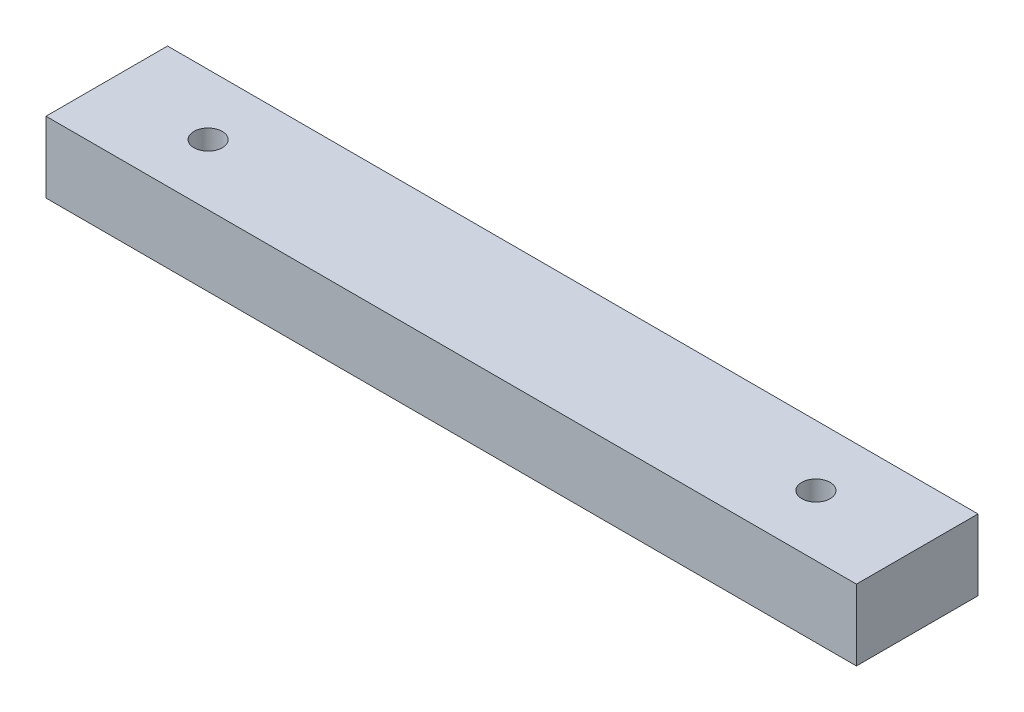
ISO-10303-21;
HEADER;
FILE_DESCRIPTION(('STEP AP214'),'2;1');
FILE_NAME('part.step','',(''),(''),'','','');
FILE_SCHEMA(('AUTOMOTIVE_DESIGN { 1 0 10303 214 1 1 1 1 }'));
ENDSEC;
DATA;
#1=APPLICATION_CONTEXT('core data for automotive mechanical design processes');
#2=APPLICATION_PROTOCOL_DEFINITION('international standard','automotive_design',2000,#1);
#3=PRODUCT_CONTEXT('',#1,'mechanical');
#4=PRODUCT('Part','Part','',(#3));
#5=PRODUCT_RELATED_PRODUCT_CATEGORY('part','',(#4));
#6=PRODUCT_DEFINITION_FORMATION('','',#4);
#7=PRODUCT_DEFINITION_CONTEXT('part definition',#1,'design');
#8=PRODUCT_DEFINITION('design','',#6,#7);
#9=PRODUCT_DEFINITION_SHAPE('','',#8);
#10=(LENGTH_UNIT() NAMED_UNIT(*) SI_UNIT(.MILLI.,.METRE.));
#11=(NAMED_UNIT(*) PLANE_ANGLE_UNIT() SI_UNIT($,.RADIAN.));
#12=(NAMED_UNIT(*) SI_UNIT($,.STERADIAN.) SOLID_ANGLE_UNIT());
#13=UNCERTAINTY_MEASURE_WITH_UNIT(LENGTH_MEASURE(1.E-05),#10,'distance_accuracy_value','');
#14=(GEOMETRIC_REPRESENTATION_CONTEXT(3) GLOBAL_UNCERTAINTY_ASSIGNED_CONTEXT((#13)) GLOBAL_UNIT_ASSIGNED_CONTEXT((#10,
#11,#12)) REPRESENTATION_CONTEXT('',''));
#15=CARTESIAN_POINT('',(0.,0.,0.));
#16=DIRECTION('',(0.,0.,1.));
#17=DIRECTION('',(1.,0.,0.));
#18=AXIS2_PLACEMENT_3D('',#15,#16,#17);
#19=CARTESIAN_POINT('',(200.,35.,30.));
#20=DIRECTION('',(-1.,0.,0.));
#21=DIRECTION('',(0.,0.,1.));
#22=AXIS2_PLACEMENT_3D('',#19,#20,#21);
#23=PLANE('',#22);
#24=DIRECTION('',(0.,0.,-1.));
#25=VECTOR('',#24,1.);
#26=CARTESIAN_POINT('',(200.,0.,30.));
#27=LINE('',#26,#25);
#28=CARTESIAN_POINT('',(200.,0.,30.));
#29=VERTEX_POINT('',#28);
#30=CARTESIAN_POINT('',(200.,0.,-30.));
#31=VERTEX_POINT('',#30);
#32=EDGE_CURVE('E201',#29,#31,#27,.T.);
#33=ORIENTED_EDGE('',*,*,#32,.T.);
#34=DIRECTION('',(0.,-1.,0.));
#35=VECTOR('',#34,1.);
#36=CARTESIAN_POINT('',(200.,35.,-30.));
#37=LINE('',#36,#35);
#38=CARTESIAN_POINT('',(200.,35.,-30.));
#39=VERTEX_POINT('',#38);
#40=EDGE_CURVE('E11',#39,#31,#37,.T.);
#41=ORIENTED_EDGE('',*,*,#40,.F.);
#42=DIRECTION('',(0.,0.,-1.));
#43=VECTOR('',#42,1.);
#44=CARTESIAN_POINT('',(200.,35.,30.));
#45=LINE('',#44,#43);
#46=CARTESIAN_POINT('',(200.,35.,30.));
#47=VERTEX_POINT('',#46);
#48=EDGE_CURVE('E215',#47,#39,#45,.T.);
#49=ORIENTED_EDGE('',*,*,#48,.F.);
#50=DIRECTION('',(0.,-1.,0.));
#51=VECTOR('',#50,1.);
#52=CARTESIAN_POINT('',(200.,35.,30.));
#53=LINE('',#52,#51);
#54=EDGE_CURVE('E217',#47,#29,#53,.T.);
#55=ORIENTED_EDGE('',*,*,#54,.T.);
#56=EDGE_LOOP('',(#33,#41,#49,#55));
#57=FACE_BOUND('',#56,.T.);
#58=ADVANCED_FACE('F50',(#57),#23,.F.);
#59=CARTESIAN_POINT('',(-200.,35.,-30.));
#60=DIRECTION('',(0.,0.,1.));
#61=DIRECTION('',(1.,0.,0.));
#62=AXIS2_PLACEMENT_3D('',#59,#60,#61);
#63=PLANE('',#62);
#64=DIRECTION('',(-1.,0.,0.));
#65=VECTOR('',#64,1.);
#66=CARTESIAN_POINT('',(-200.,0.,-30.));
#67=LINE('',#66,#65);
#68=CARTESIAN_POINT('',(-200.,0.,-30.));
#69=VERTEX_POINT('',#68);
#70=EDGE_CURVE('E222',#31,#69,#67,.T.);
#71=ORIENTED_EDGE('',*,*,#70,.T.);
#72=DIRECTION('',(0.,-1.,0.));
#73=VECTOR('',#72,1.);
#74=CARTESIAN_POINT('',(-200.,35.,-30.));
#75=LINE('',#74,#73);
#76=CARTESIAN_POINT('',(-200.,35.,-30.));
#77=VERTEX_POINT('',#76);
#78=EDGE_CURVE('E54',#77,#69,#75,.T.);
#79=ORIENTED_EDGE('',*,*,#78,.F.);
#80=DIRECTION('',(-1.,0.,0.));
#81=VECTOR('',#80,1.);
#82=CARTESIAN_POINT('',(-200.,35.,-30.));
#83=LINE('',#82,#81);
#84=EDGE_CURVE('E94',#39,#77,#83,.T.);
#85=ORIENTED_EDGE('',*,*,#84,.F.);
#86=ORIENTED_EDGE('',*,*,#40,.T.);
#87=EDGE_LOOP('',(#71,#79,#85,#86));
#88=FACE_BOUND('',#87,.T.);
#89=ADVANCED_FACE('F245',(#88),#63,.F.);
#90=CARTESIAN_POINT('',(-200.,35.,30.));
#91=DIRECTION('',(1.,0.,0.));
#92=DIRECTION('',(0.,0.,-1.));
#93=AXIS2_PLACEMENT_3D('',#90,#91,#92);
#94=PLANE('',#93);
#95=DIRECTION('',(0.,0.,1.));
#96=VECTOR('',#95,1.);
#97=CARTESIAN_POINT('',(-200.,0.,30.));
#98=LINE('',#97,#96);
#99=CARTESIAN_POINT('',(-200.,0.,30.));
#100=VERTEX_POINT('',#99);
#101=EDGE_CURVE('E81',#69,#100,#98,.T.);
#102=ORIENTED_EDGE('',*,*,#101,.T.);
#103=DIRECTION('',(0.,-1.,0.));
#104=VECTOR('',#103,1.);
#105=CARTESIAN_POINT('',(-200.,35.,30.));
#106=LINE('',#105,#104);
#107=CARTESIAN_POINT('',(-200.,35.,30.));
#108=VERTEX_POINT('',#107);
#109=EDGE_CURVE('E226',#108,#100,#106,.T.);
#110=ORIENTED_EDGE('',*,*,#109,.F.);
#111=DIRECTION('',(0.,0.,1.));
#112=VECTOR('',#111,1.);
#113=CARTESIAN_POINT('',(-200.,35.,30.));
#114=LINE('',#113,#112);
#115=EDGE_CURVE('E214',#77,#108,#114,.T.);
#116=ORIENTED_EDGE('',*,*,#115,.F.);
#117=ORIENTED_EDGE('',*,*,#78,.T.);
#118=EDGE_LOOP('',(#102,#110,#116,#117));
#119=FACE_BOUND('',#118,.T.);
#120=ADVANCED_FACE('F229',(#119),#94,.F.);
#121=CARTESIAN_POINT('',(-200.,35.,30.));
#122=DIRECTION('',(0.,0.,-1.));
#123=DIRECTION('',(-1.,0.,0.));
#124=AXIS2_PLACEMENT_3D('',#121,#122,#123);
#125=PLANE('',#124);
#126=DIRECTION('',(1.,0.,0.));
#127=VECTOR('',#126,1.);
#128=CARTESIAN_POINT('',(-200.,0.,30.));
#129=LINE('',#128,#127);
#130=EDGE_CURVE('E87',#100,#29,#129,.T.);
#131=ORIENTED_EDGE('',*,*,#130,.T.);
#132=ORIENTED_EDGE('',*,*,#54,.F.);
#133=DIRECTION('',(1.,0.,0.));
#134=VECTOR('',#133,1.);
#135=CARTESIAN_POINT('',(-200.,35.,30.));
#136=LINE('',#135,#134);
#137=EDGE_CURVE('E64',#108,#47,#136,.T.);
#138=ORIENTED_EDGE('',*,*,#137,.F.);
#139=ORIENTED_EDGE('',*,*,#109,.T.);
#140=EDGE_LOOP('',(#131,#132,#138,#139));
#141=FACE_BOUND('',#140,.T.);
#142=ADVANCED_FACE('F235',(#141),#125,.F.);
#143=CARTESIAN_POINT('',(0.,35.,0.));
#144=DIRECTION('',(0.,-1.,0.));
#145=DIRECTION('',(0.,0.,-1.));
#146=AXIS2_PLACEMENT_3D('',#143,#144,#145);
#147=PLANE('',#146);
#148=CARTESIAN_POINT('',(-150.,35.,0.));
#149=DIRECTION('',(0.,1.,0.));
#150=DIRECTION('',(0.,0.,1.));
#151=AXIS2_PLACEMENT_3D('',#148,#149,#150);
#152=CIRCLE('',#151,7.00000000000001);
#153=CARTESIAN_POINT('',(-150.,35.,7.00000000000001));
#154=VERTEX_POINT('',#153);
#155=EDGE_CURVE('E204',#154,#154,#152,.T.);
#156=ORIENTED_EDGE('',*,*,#155,.F.);
#157=EDGE_LOOP('',(#156));
#158=FACE_BOUND('',#157,.T.);
#159=CARTESIAN_POINT('',(150.,35.,0.));
#160=DIRECTION('',(0.,1.,0.));
#161=DIRECTION('',(0.,0.,1.));
#162=AXIS2_PLACEMENT_3D('',#159,#160,#161);
#163=CIRCLE('',#162,7.00000000000001);
#164=CARTESIAN_POINT('',(150.,35.,7.00000000000001));
#165=VERTEX_POINT('',#164);
#166=EDGE_CURVE('E210',#165,#165,#163,.T.);
#167=ORIENTED_EDGE('',*,*,#166,.F.);
#168=EDGE_LOOP('',(#167));
#169=FACE_BOUND('',#168,.T.);
#170=ORIENTED_EDGE('',*,*,#48,.T.);
#171=ORIENTED_EDGE('',*,*,#84,.T.);
#172=ORIENTED_EDGE('',*,*,#115,.T.);
#173=ORIENTED_EDGE('',*,*,#137,.T.);
#174=EDGE_LOOP('',(#170,#171,#172,#173));
#175=FACE_BOUND('',#174,.T.);
#176=ADVANCED_FACE('F240',(#158,#169,#175),#147,.F.);
#177=CARTESIAN_POINT('',(0.,0.,0.));
#178=DIRECTION('',(0.,-1.,0.));
#179=DIRECTION('',(0.,0.,-1.));
#180=AXIS2_PLACEMENT_3D('',#177,#178,#179);
#181=PLANE('',#180);
#182=CARTESIAN_POINT('',(-168.77,0.,18.77));
#183=DIRECTION('',(0.,-1.,0.));
#184=DIRECTION('',(0.,0.,-1.));
#185=AXIS2_PLACEMENT_3D('',#182,#183,#184);
#186=CIRCLE('',#185,3.81000000000001);
#187=CARTESIAN_POINT('',(-168.77,0.,14.96));
#188=VERTEX_POINT('',#187);
#189=EDGE_CURVE('E136',#188,#188,#186,.T.);
#190=ORIENTED_EDGE('',*,*,#189,.F.);
#191=EDGE_LOOP('',(#190));
#192=FACE_BOUND('',#191,.T.);
#193=CARTESIAN_POINT('',(-131.23,0.,18.77));
#194=DIRECTION('',(0.,-1.,0.));
#195=DIRECTION('',(0.,0.,-1.));
#196=AXIS2_PLACEMENT_3D('',#193,#194,#195);
#197=CIRCLE('',#196,3.81000000000001);
#198=CARTESIAN_POINT('',(-131.23,0.,14.96));
#199=VERTEX_POINT('',#198);
#200=EDGE_CURVE('E129',#199,#199,#197,.T.);
#201=ORIENTED_EDGE('',*,*,#200,.F.);
#202=EDGE_LOOP('',(#201));
#203=FACE_BOUND('',#202,.T.);
#204=CARTESIAN_POINT('',(-131.23,0.,-18.77));
#205=DIRECTION('',(0.,-1.,0.));
#206=DIRECTION('',(0.,0.,-1.));
#207=AXIS2_PLACEMENT_3D('',#204,#205,#206);
#208=CIRCLE('',#207,3.81000000000001);
#209=CARTESIAN_POINT('',(-131.23,0.,-22.58));
#210=VERTEX_POINT('',#209);
#211=EDGE_CURVE('E144',#210,#210,#208,.T.);
#212=ORIENTED_EDGE('',*,*,#211,.F.);
#213=EDGE_LOOP('',(#212));
#214=FACE_BOUND('',#213,.T.);
#215=CARTESIAN_POINT('',(-168.77,0.,-18.77));
#216=DIRECTION('',(0.,-1.,0.));
#217=DIRECTION('',(0.,0.,-1.));
#218=AXIS2_PLACEMENT_3D('',#215,#216,#217);
#219=CIRCLE('',#218,3.81000000000001);
#220=CARTESIAN_POINT('',(-168.77,0.,-22.58));
#221=VERTEX_POINT('',#220);
#222=EDGE_CURVE('E152',#221,#221,#219,.T.);
#223=ORIENTED_EDGE('',*,*,#222,.F.);
#224=EDGE_LOOP('',(#223));
#225=FACE_BOUND('',#224,.T.);
#226=CARTESIAN_POINT('',(131.23,0.,18.77));
#227=DIRECTION('',(0.,-1.,0.));
#228=DIRECTION('',(0.,0.,-1.));
#229=AXIS2_PLACEMENT_3D('',#226,#227,#228);
#230=CIRCLE('',#229,3.81000000000001);
#231=CARTESIAN_POINT('',(131.23,0.,14.96));
#232=VERTEX_POINT('',#231);
#233=EDGE_CURVE('E162',#232,#232,#230,.T.);
#234=ORIENTED_EDGE('',*,*,#233,.F.);
#235=EDGE_LOOP('',(#234));
#236=FACE_BOUND('',#235,.T.);
#237=CARTESIAN_POINT('',(168.77,0.,18.77));
#238=DIRECTION('',(0.,-1.,0.));
#239=DIRECTION('',(0.,0.,-1.));
#240=AXIS2_PLACEMENT_3D('',#237,#238,#239);
#241=CIRCLE('',#240,3.81000000000001);
#242=CARTESIAN_POINT('',(168.77,0.,14.96));
#243=VERTEX_POINT('',#242);
#244=EDGE_CURVE('E172',#243,#243,#241,.T.);
#245=ORIENTED_EDGE('',*,*,#244,.F.);
#246=EDGE_LOOP('',(#245));
#247=FACE_BOUND('',#246,.T.);
#248=CARTESIAN_POINT('',(168.77,0.,-18.77));
#249=DIRECTION('',(0.,-1.,0.));
#250=DIRECTION('',(0.,0.,-1.));
#251=AXIS2_PLACEMENT_3D('',#248,#249,#250);
#252=CIRCLE('',#251,3.81000000000001);
#253=CARTESIAN_POINT('',(168.77,0.,-22.58));
#254=VERTEX_POINT('',#253);
#255=EDGE_CURVE('E182',#254,#254,#252,.T.);
#256=ORIENTED_EDGE('',*,*,#255,.F.);
#257=EDGE_LOOP('',(#256));
#258=FACE_BOUND('',#257,.T.);
#259=CARTESIAN_POINT('',(131.23,0.,-18.77));
#260=DIRECTION('',(0.,-1.,0.));
#261=DIRECTION('',(0.,0.,-1.));
#262=AXIS2_PLACEMENT_3D('',#259,#260,#261);
#263=CIRCLE('',#262,3.81000000000001);
#264=CARTESIAN_POINT('',(131.23,0.,-22.58));
#265=VERTEX_POINT('',#264);
#266=EDGE_CURVE('E190',#265,#265,#263,.T.);
#267=ORIENTED_EDGE('',*,*,#266,.F.);
#268=EDGE_LOOP('',(#267));
#269=FACE_BOUND('',#268,.T.);
#270=CARTESIAN_POINT('',(-150.,0.,0.));
#271=DIRECTION('',(0.,1.,0.));
#272=DIRECTION('',(0.,0.,1.));
#273=AXIS2_PLACEMENT_3D('',#270,#271,#272);
#274=CIRCLE('',#273,7.00000000000001);
#275=CARTESIAN_POINT('',(-150.,0.,7.00000000000001));
#276=VERTEX_POINT('',#275);
#277=EDGE_CURVE('E199',#276,#276,#274,.T.);
#278=ORIENTED_EDGE('',*,*,#277,.T.);
#279=EDGE_LOOP('',(#278));
#280=FACE_BOUND('',#279,.T.);
#281=CARTESIAN_POINT('',(150.,0.,0.));
#282=DIRECTION('',(0.,1.,0.));
#283=DIRECTION('',(0.,0.,1.));
#284=AXIS2_PLACEMENT_3D('',#281,#282,#283);
#285=CIRCLE('',#284,7.00000000000001);
#286=CARTESIAN_POINT('',(150.,0.,7.00000000000001));
#287=VERTEX_POINT('',#286);
#288=EDGE_CURVE('E200',#287,#287,#285,.T.);
#289=ORIENTED_EDGE('',*,*,#288,.T.);
#290=EDGE_LOOP('',(#289));
#291=FACE_BOUND('',#290,.T.);
#292=ORIENTED_EDGE('',*,*,#32,.F.);
#293=ORIENTED_EDGE('',*,*,#130,.F.);
#294=ORIENTED_EDGE('',*,*,#101,.F.);
#295=ORIENTED_EDGE('',*,*,#70,.F.);
#296=EDGE_LOOP('',(#292,#293,#294,#295));
#297=FACE_BOUND('',#296,.T.);
#298=ADVANCED_FACE('F231',(#192,#203,#214,#225,#236,#247,#258,#269,#280,#291,#297),#181,.T.);
#299=CARTESIAN_POINT('',(150.,0.,0.));
#300=DIRECTION('',(0.,1.,0.));
#301=DIRECTION('',(0.,0.,1.));
#302=AXIS2_PLACEMENT_3D('',#299,#300,#301);
#303=CYLINDRICAL_SURFACE('',#302,7.00000000000001);
#304=ORIENTED_EDGE('',*,*,#288,.F.);
#305=EDGE_LOOP('',(#304));
#306=FACE_BOUND('',#305,.T.);
#307=ORIENTED_EDGE('',*,*,#166,.T.);
#308=EDGE_LOOP('',(#307));
#309=FACE_BOUND('',#308,.T.);
#310=ADVANCED_FACE('F281',(#306,#309),#303,.F.);
#311=CARTESIAN_POINT('',(-150.,0.,0.));
#312=DIRECTION('',(0.,1.,0.));
#313=DIRECTION('',(0.,0.,1.));
#314=AXIS2_PLACEMENT_3D('',#311,#312,#313);
#315=CYLINDRICAL_SURFACE('',#314,7.00000000000001);
#316=ORIENTED_EDGE('',*,*,#277,.F.);
#317=EDGE_LOOP('',(#316));
#318=FACE_BOUND('',#317,.T.);
#319=ORIENTED_EDGE('',*,*,#155,.T.);
#320=EDGE_LOOP('',(#319));
#321=FACE_BOUND('',#320,.T.);
#322=ADVANCED_FACE('F290',(#318,#321),#315,.F.);
#323=CARTESIAN_POINT('',(131.23,18.,-18.77));
#324=DIRECTION('',(0.,-1.,0.));
#325=DIRECTION('',(0.,0.,-1.));
#326=AXIS2_PLACEMENT_3D('',#323,#324,#325);
#327=CONICAL_SURFACE('',#326,2.55269999999999,1.02974425867665);
#328=CARTESIAN_POINT('',(131.23,19.5338169021917,-18.77));
#329=VERTEX_POINT('',#328);
#330=VERTEX_LOOP('',#329);
#331=FACE_BOUND('',#330,.T.);
#332=CARTESIAN_POINT('',(131.23,18.,-18.77));
#333=DIRECTION('',(0.,-1.,0.));
#334=DIRECTION('',(0.,0.,-1.));
#335=AXIS2_PLACEMENT_3D('',#332,#333,#334);
#336=CIRCLE('',#335,2.55269999999999);
#337=CARTESIAN_POINT('',(131.23,18.,-21.3227));
#338=VERTEX_POINT('',#337);
#339=EDGE_CURVE('E198',#338,#338,#336,.T.);
#340=ORIENTED_EDGE('',*,*,#339,.T.);
#341=EDGE_LOOP('',(#340));
#342=FACE_BOUND('',#341,.T.);
#343=ADVANCED_FACE('F300',(#331,#342),#327,.F.);
#344=CARTESIAN_POINT('',(131.23,0.,-18.77));
#345=DIRECTION('',(0.,-1.,0.));
#346=DIRECTION('',(0.,0.,-1.));
#347=AXIS2_PLACEMENT_3D('',#344,#345,#346);
#348=CYLINDRICAL_SURFACE('',#347,2.55269999999999);
#349=ORIENTED_EDGE('',*,*,#339,.F.);
#350=EDGE_LOOP('',(#349));
#351=FACE_BOUND('',#350,.T.);
#352=CARTESIAN_POINT('',(131.23,1.2573,-18.77));
#353=DIRECTION('',(0.,-1.,0.));
#354=DIRECTION('',(0.,0.,-1.));
#355=AXIS2_PLACEMENT_3D('',#352,#353,#354);
#356=CIRCLE('',#355,2.55269999999999);
#357=CARTESIAN_POINT('',(131.23,1.2573,-21.3227));
#358=VERTEX_POINT('',#357);
#359=EDGE_CURVE('E194',#358,#358,#356,.T.);
#360=ORIENTED_EDGE('',*,*,#359,.T.);
#361=EDGE_LOOP('',(#360));
#362=FACE_BOUND('',#361,.T.);
#363=ADVANCED_FACE('F309',(#351,#362),#348,.F.);
#364=CARTESIAN_POINT('',(131.23,0.,-18.77));
#365=DIRECTION('',(0.,-1.,0.));
#366=DIRECTION('',(0.,0.,-1.));
#367=AXIS2_PLACEMENT_3D('',#364,#365,#366);
#368=CONICAL_SURFACE('',#367,3.81000000000001,0.785398163397454);
#369=ORIENTED_EDGE('',*,*,#359,.F.);
#370=EDGE_LOOP('',(#369));
#371=FACE_BOUND('',#370,.T.);
#372=ORIENTED_EDGE('',*,*,#266,.T.);
#373=EDGE_LOOP('',(#372));
#374=FACE_BOUND('',#373,.T.);
#375=ADVANCED_FACE('F321',(#371,#374),#368,.F.);
#376=CARTESIAN_POINT('',(168.77,18.,-18.77));
#377=DIRECTION('',(0.,-1.,0.));
#378=DIRECTION('',(0.,0.,-1.));
#379=AXIS2_PLACEMENT_3D('',#376,#377,#378);
#380=CONICAL_SURFACE('',#379,2.55269999999999,1.02974425867665);
#381=CARTESIAN_POINT('',(168.77,19.5338169021917,-18.77));
#382=VERTEX_POINT('',#381);
#383=VERTEX_LOOP('',#382);
#384=FACE_BOUND('',#383,.T.);
#385=CARTESIAN_POINT('',(168.77,18.,-18.77));
#386=DIRECTION('',(0.,-1.,0.));
#387=DIRECTION('',(0.,0.,-1.));
#388=AXIS2_PLACEMENT_3D('',#385,#386,#387);
#389=CIRCLE('',#388,2.55269999999999);
#390=CARTESIAN_POINT('',(168.77,18.,-21.3227));
#391=VERTEX_POINT('',#390);
#392=EDGE_CURVE('E187',#391,#391,#389,.T.);
#393=ORIENTED_EDGE('',*,*,#392,.T.);
#394=EDGE_LOOP('',(#393));
#395=FACE_BOUND('',#394,.T.);
#396=ADVANCED_FACE('F334',(#384,#395),#380,.F.);
#397=CARTESIAN_POINT('',(168.77,0.,-18.77));
#398=DIRECTION('',(0.,-1.,0.));
#399=DIRECTION('',(0.,0.,-1.));
#400=AXIS2_PLACEMENT_3D('',#397,#398,#399);
#401=CYLINDRICAL_SURFACE('',#400,2.55269999999999);
#402=ORIENTED_EDGE('',*,*,#392,.F.);
#403=EDGE_LOOP('',(#402));
#404=FACE_BOUND('',#403,.T.);
#405=CARTESIAN_POINT('',(168.77,1.2573,-18.77));
#406=DIRECTION('',(0.,-1.,0.));
#407=DIRECTION('',(0.,0.,-1.));
#408=AXIS2_PLACEMENT_3D('',#405,#406,#407);
#409=CIRCLE('',#408,2.55269999999999);
#410=CARTESIAN_POINT('',(168.77,1.2573,-21.3227));
#411=VERTEX_POINT('',#410);
#412=EDGE_CURVE('E184',#411,#411,#409,.T.);
#413=ORIENTED_EDGE('',*,*,#412,.T.);
#414=EDGE_LOOP('',(#413));
#415=FACE_BOUND('',#414,.T.);
#416=ADVANCED_FACE('F344',(#404,#415),#401,.F.);
#417=CARTESIAN_POINT('',(168.77,0.,-18.77));
#418=DIRECTION('',(0.,-1.,0.));
#419=DIRECTION('',(0.,0.,-1.));
#420=AXIS2_PLACEMENT_3D('',#417,#418,#419);
#421=CONICAL_SURFACE('',#420,3.81000000000001,0.785398163397454);
#422=ORIENTED_EDGE('',*,*,#412,.F.);
#423=EDGE_LOOP('',(#422));
#424=FACE_BOUND('',#423,.T.);
#425=ORIENTED_EDGE('',*,*,#255,.T.);
#426=EDGE_LOOP('',(#425));
#427=FACE_BOUND('',#426,.T.);
#428=ADVANCED_FACE('F353',(#424,#427),#421,.F.);
#429=CARTESIAN_POINT('',(168.77,18.,18.77));
#430=DIRECTION('',(0.,-1.,0.));
#431=DIRECTION('',(0.,0.,-1.));
#432=AXIS2_PLACEMENT_3D('',#429,#430,#431);
#433=CONICAL_SURFACE('',#432,2.55269999999999,1.02974425867665);
#434=CARTESIAN_POINT('',(168.77,19.5338169021917,18.77));
#435=VERTEX_POINT('',#434);
#436=VERTEX_LOOP('',#435);
#437=FACE_BOUND('',#436,.T.);
#438=CARTESIAN_POINT('',(168.77,18.,18.77));
#439=DIRECTION('',(0.,-1.,0.));
#440=DIRECTION('',(0.,0.,-1.));
#441=AXIS2_PLACEMENT_3D('',#438,#439,#440);
#442=CIRCLE('',#441,2.55269999999999);
#443=CARTESIAN_POINT('',(168.77,18.,16.2173));
#444=VERTEX_POINT('',#443);
#445=EDGE_CURVE('E179',#444,#444,#442,.T.);
#446=ORIENTED_EDGE('',*,*,#445,.T.);
#447=EDGE_LOOP('',(#446));
#448=FACE_BOUND('',#447,.T.);
#449=ADVANCED_FACE('F368',(#437,#448),#433,.F.);
#450=CARTESIAN_POINT('',(168.77,0.,18.77));
#451=DIRECTION('',(0.,-1.,0.));
#452=DIRECTION('',(0.,0.,-1.));
#453=AXIS2_PLACEMENT_3D('',#450,#451,#452);
#454=CYLINDRICAL_SURFACE('',#453,2.55269999999999);
#455=ORIENTED_EDGE('',*,*,#445,.F.);
#456=EDGE_LOOP('',(#455));
#457=FACE_BOUND('',#456,.T.);
#458=CARTESIAN_POINT('',(168.77,1.2573,18.77));
#459=DIRECTION('',(0.,-1.,0.));
#460=DIRECTION('',(0.,0.,-1.));
#461=AXIS2_PLACEMENT_3D('',#458,#459,#460);
#462=CIRCLE('',#461,2.55269999999999);
#463=CARTESIAN_POINT('',(168.77,1.2573,16.2173));
#464=VERTEX_POINT('',#463);
#465=EDGE_CURVE('E175',#464,#464,#462,.T.);
#466=ORIENTED_EDGE('',*,*,#465,.T.);
#467=EDGE_LOOP('',(#466));
#468=FACE_BOUND('',#467,.T.);
#469=ADVANCED_FACE('F376',(#457,#468),#454,.F.);
#470=CARTESIAN_POINT('',(168.77,0.,18.77));
#471=DIRECTION('',(0.,-1.,0.));
#472=DIRECTION('',(0.,0.,-1.));
#473=AXIS2_PLACEMENT_3D('',#470,#471,#472);
#474=CONICAL_SURFACE('',#473,3.81000000000001,0.785398163397454);
#475=ORIENTED_EDGE('',*,*,#465,.F.);
#476=EDGE_LOOP('',(#475));
#477=FACE_BOUND('',#476,.T.);
#478=ORIENTED_EDGE('',*,*,#244,.T.);
#479=EDGE_LOOP('',(#478));
#480=FACE_BOUND('',#479,.T.);
#481=ADVANCED_FACE('F390',(#477,#480),#474,.F.);
#482=CARTESIAN_POINT('',(131.23,18.,18.77));
#483=DIRECTION('',(0.,-1.,0.));
#484=DIRECTION('',(0.,0.,-1.));
#485=AXIS2_PLACEMENT_3D('',#482,#483,#484);
#486=CONICAL_SURFACE('',#485,2.55269999999999,1.02974425867665);
#487=CARTESIAN_POINT('',(131.23,19.5338169021917,18.77));
#488=VERTEX_POINT('',#487);
#489=VERTEX_LOOP('',#488);
#490=FACE_BOUND('',#489,.T.);
#491=CARTESIAN_POINT('',(131.23,18.,18.77));
#492=DIRECTION('',(0.,-1.,0.));
#493=DIRECTION('',(0.,0.,-1.));
#494=AXIS2_PLACEMENT_3D('',#491,#492,#493);
#495=CIRCLE('',#494,2.55269999999999);
#496=CARTESIAN_POINT('',(131.23,18.,16.2173));
#497=VERTEX_POINT('',#496);
#498=EDGE_CURVE('E166',#497,#497,#495,.T.);
#499=ORIENTED_EDGE('',*,*,#498,.T.);
#500=EDGE_LOOP('',(#499));
#501=FACE_BOUND('',#500,.T.);
#502=ADVANCED_FACE('F398',(#490,#501),#486,.F.);
#503=CARTESIAN_POINT('',(131.23,0.,18.77));
#504=DIRECTION('',(0.,-1.,0.));
#505=DIRECTION('',(0.,0.,-1.));
#506=AXIS2_PLACEMENT_3D('',#503,#504,#505);
#507=CYLINDRICAL_SURFACE('',#506,2.55269999999999);
#508=ORIENTED_EDGE('',*,*,#498,.F.);
#509=EDGE_LOOP('',(#508));
#510=FACE_BOUND('',#509,.T.);
#511=CARTESIAN_POINT('',(131.23,1.2573,18.77));
#512=DIRECTION('',(0.,-1.,0.));
#513=DIRECTION('',(0.,0.,-1.));
#514=AXIS2_PLACEMENT_3D('',#511,#512,#513);
#515=CIRCLE('',#514,2.55269999999999);
#516=CARTESIAN_POINT('',(131.23,1.2573,16.2173));
#517=VERTEX_POINT('',#516);
#518=EDGE_CURVE('E167',#517,#517,#515,.T.);
#519=ORIENTED_EDGE('',*,*,#518,.T.);
#520=EDGE_LOOP('',(#519));
#521=FACE_BOUND('',#520,.T.);
#522=ADVANCED_FACE('F408',(#510,#521),#507,.F.);
#523=CARTESIAN_POINT('',(131.23,0.,18.77));
#524=DIRECTION('',(0.,-1.,0.));
#525=DIRECTION('',(0.,0.,-1.));
#526=AXIS2_PLACEMENT_3D('',#523,#524,#525);
#527=CONICAL_SURFACE('',#526,3.81000000000001,0.785398163397454);
#528=ORIENTED_EDGE('',*,*,#518,.F.);
#529=EDGE_LOOP('',(#528));
#530=FACE_BOUND('',#529,.T.);
#531=ORIENTED_EDGE('',*,*,#233,.T.);
#532=EDGE_LOOP('',(#531));
#533=FACE_BOUND('',#532,.T.);
#534=ADVANCED_FACE('F419',(#530,#533),#527,.F.);
#535=CARTESIAN_POINT('',(-168.77,18.,-18.77));
#536=DIRECTION('',(0.,-1.,0.));
#537=DIRECTION('',(0.,0.,-1.));
#538=AXIS2_PLACEMENT_3D('',#535,#536,#537);
#539=CONICAL_SURFACE('',#538,2.55269999999999,1.02974425867665);
#540=CARTESIAN_POINT('',(-168.77,19.5338169021917,-18.77));
#541=VERTEX_POINT('',#540);
#542=VERTEX_LOOP('',#541);
#543=FACE_BOUND('',#542,.T.);
#544=CARTESIAN_POINT('',(-168.77,18.,-18.77));
#545=DIRECTION('',(0.,-1.,0.));
#546=DIRECTION('',(0.,0.,-1.));
#547=AXIS2_PLACEMENT_3D('',#544,#545,#546);
#548=CIRCLE('',#547,2.55269999999999);
#549=CARTESIAN_POINT('',(-168.77,18.,-21.3227));
#550=VERTEX_POINT('',#549);
#551=EDGE_CURVE('E159',#550,#550,#548,.T.);
#552=ORIENTED_EDGE('',*,*,#551,.T.);
#553=EDGE_LOOP('',(#552));
#554=FACE_BOUND('',#553,.T.);
#555=ADVANCED_FACE('F435',(#543,#554),#539,.F.);
#556=CARTESIAN_POINT('',(-168.77,0.,-18.77));
#557=DIRECTION('',(0.,-1.,0.));
#558=DIRECTION('',(0.,0.,-1.));
#559=AXIS2_PLACEMENT_3D('',#556,#557,#558);
#560=CYLINDRICAL_SURFACE('',#559,2.55269999999999);
#561=ORIENTED_EDGE('',*,*,#551,.F.);
#562=EDGE_LOOP('',(#561));
#563=FACE_BOUND('',#562,.T.);
#564=CARTESIAN_POINT('',(-168.77,1.2573,-18.77));
#565=DIRECTION('',(0.,-1.,0.));
#566=DIRECTION('',(0.,0.,-1.));
#567=AXIS2_PLACEMENT_3D('',#564,#565,#566);
#568=CIRCLE('',#567,2.55269999999999);
#569=CARTESIAN_POINT('',(-168.77,1.2573,-21.3227));
#570=VERTEX_POINT('',#569);
#571=EDGE_CURVE('E160',#570,#570,#568,.T.);
#572=ORIENTED_EDGE('',*,*,#571,.T.);
#573=EDGE_LOOP('',(#572));
#574=FACE_BOUND('',#573,.T.);
#575=ADVANCED_FACE('F445',(#563,#574),#560,.F.);
#576=CARTESIAN_POINT('',(-168.77,0.,-18.77));
#577=DIRECTION('',(0.,-1.,0.));
#578=DIRECTION('',(0.,0.,-1.));
#579=AXIS2_PLACEMENT_3D('',#576,#577,#578);
#580=CONICAL_SURFACE('',#579,3.81000000000001,0.785398163397454);
#581=ORIENTED_EDGE('',*,*,#571,.F.);
#582=EDGE_LOOP('',(#581));
#583=FACE_BOUND('',#582,.T.);
#584=ORIENTED_EDGE('',*,*,#222,.T.);
#585=EDGE_LOOP('',(#584));
#586=FACE_BOUND('',#585,.T.);
#587=ADVANCED_FACE('F454',(#583,#586),#580,.F.);
#588=CARTESIAN_POINT('',(-131.23,18.,-18.77));
#589=DIRECTION('',(0.,-1.,0.));
#590=DIRECTION('',(0.,0.,-1.));
#591=AXIS2_PLACEMENT_3D('',#588,#589,#590);
#592=CONICAL_SURFACE('',#591,2.55269999999999,1.02974425867665);
#593=CARTESIAN_POINT('',(-131.23,19.5338169021917,-18.77));
#594=VERTEX_POINT('',#593);
#595=VERTEX_LOOP('',#594);
#596=FACE_BOUND('',#595,.T.);
#597=CARTESIAN_POINT('',(-131.23,18.,-18.77));
#598=DIRECTION('',(0.,-1.,0.));
#599=DIRECTION('',(0.,0.,-1.));
#600=AXIS2_PLACEMENT_3D('',#597,#598,#599);
#601=CIRCLE('',#600,2.55269999999999);
#602=CARTESIAN_POINT('',(-131.23,18.,-21.3227));
#603=VERTEX_POINT('',#602);
#604=EDGE_CURVE('E151',#603,#603,#601,.T.);
#605=ORIENTED_EDGE('',*,*,#604,.T.);
#606=EDGE_LOOP('',(#605));
#607=FACE_BOUND('',#606,.T.);
#608=ADVANCED_FACE('F465',(#596,#607),#592,.F.);
#609=CARTESIAN_POINT('',(-131.23,0.,-18.77));
#610=DIRECTION('',(0.,-1.,0.));
#611=DIRECTION('',(0.,0.,-1.));
#612=AXIS2_PLACEMENT_3D('',#609,#610,#611);
#613=CYLINDRICAL_SURFACE('',#612,2.55269999999999);
#614=ORIENTED_EDGE('',*,*,#604,.F.);
#615=EDGE_LOOP('',(#614));
#616=FACE_BOUND('',#615,.T.);
#617=CARTESIAN_POINT('',(-131.23,1.2573,-18.77));
#618=DIRECTION('',(0.,-1.,0.));
#619=DIRECTION('',(0.,0.,-1.));
#620=AXIS2_PLACEMENT_3D('',#617,#618,#619);
#621=CIRCLE('',#620,2.55269999999999);
#622=CARTESIAN_POINT('',(-131.23,1.2573,-21.3227));
#623=VERTEX_POINT('',#622);
#624=EDGE_CURVE('E146',#623,#623,#621,.T.);
#625=ORIENTED_EDGE('',*,*,#624,.T.);
#626=EDGE_LOOP('',(#625));
#627=FACE_BOUND('',#626,.T.);
#628=ADVANCED_FACE('F474',(#616,#627),#613,.F.);
#629=CARTESIAN_POINT('',(-131.23,0.,-18.77));
#630=DIRECTION('',(0.,-1.,0.));
#631=DIRECTION('',(0.,0.,-1.));
#632=AXIS2_PLACEMENT_3D('',#629,#630,#631);
#633=CONICAL_SURFACE('',#632,3.81000000000001,0.785398163397454);
#634=ORIENTED_EDGE('',*,*,#624,.F.);
#635=EDGE_LOOP('',(#634));
#636=FACE_BOUND('',#635,.T.);
#637=ORIENTED_EDGE('',*,*,#211,.T.);
#638=EDGE_LOOP('',(#637));
#639=FACE_BOUND('',#638,.T.);
#640=ADVANCED_FACE('F486',(#636,#639),#633,.F.);
#641=CARTESIAN_POINT('',(-131.23,18.,18.77));
#642=DIRECTION('',(0.,-1.,0.));
#643=DIRECTION('',(0.,0.,-1.));
#644=AXIS2_PLACEMENT_3D('',#641,#642,#643);
#645=CONICAL_SURFACE('',#644,2.55269999999999,1.02974425867665);
#646=CARTESIAN_POINT('',(-131.23,19.5338169021917,18.77));
#647=VERTEX_POINT('',#646);
#648=VERTEX_LOOP('',#647);
#649=FACE_BOUND('',#648,.T.);
#650=CARTESIAN_POINT('',(-131.23,18.,18.77));
#651=DIRECTION('',(0.,-1.,0.));
#652=DIRECTION('',(0.,0.,-1.));
#653=AXIS2_PLACEMENT_3D('',#650,#651,#652);
#654=CIRCLE('',#653,2.55269999999999);
#655=CARTESIAN_POINT('',(-131.23,18.,16.2173));
#656=VERTEX_POINT('',#655);
#657=EDGE_CURVE('E142',#656,#656,#654,.T.);
#658=ORIENTED_EDGE('',*,*,#657,.T.);
#659=EDGE_LOOP('',(#658));
#660=FACE_BOUND('',#659,.T.);
#661=ADVANCED_FACE('F499',(#649,#660),#645,.F.);
#662=CARTESIAN_POINT('',(-131.23,0.,18.77));
#663=DIRECTION('',(0.,-1.,0.));
#664=DIRECTION('',(0.,0.,-1.));
#665=AXIS2_PLACEMENT_3D('',#662,#663,#664);
#666=CYLINDRICAL_SURFACE('',#665,2.55269999999999);
#667=ORIENTED_EDGE('',*,*,#657,.F.);
#668=EDGE_LOOP('',(#667));
#669=FACE_BOUND('',#668,.T.);
#670=CARTESIAN_POINT('',(-131.23,1.2573,18.77));
#671=DIRECTION('',(0.,-1.,0.));
#672=DIRECTION('',(0.,0.,-1.));
#673=AXIS2_PLACEMENT_3D('',#670,#671,#672);
#674=CIRCLE('',#673,2.55269999999999);
#675=CARTESIAN_POINT('',(-131.23,1.2573,16.2173));
#676=VERTEX_POINT('',#675);
#677=EDGE_CURVE('E134',#676,#676,#674,.T.);
#678=ORIENTED_EDGE('',*,*,#677,.T.);
#679=EDGE_LOOP('',(#678));
#680=FACE_BOUND('',#679,.T.);
#681=ADVANCED_FACE('F509',(#669,#680),#666,.F.);
#682=CARTESIAN_POINT('',(-131.23,0.,18.77));
#683=DIRECTION('',(0.,-1.,0.));
#684=DIRECTION('',(0.,0.,-1.));
#685=AXIS2_PLACEMENT_3D('',#682,#683,#684);
#686=CONICAL_SURFACE('',#685,3.81000000000001,0.785398163397454);
#687=ORIENTED_EDGE('',*,*,#677,.F.);
#688=EDGE_LOOP('',(#687));
#689=FACE_BOUND('',#688,.T.);
#690=ORIENTED_EDGE('',*,*,#200,.T.);
#691=EDGE_LOOP('',(#690));
#692=FACE_BOUND('',#691,.T.);
#693=ADVANCED_FACE('F124',(#689,#692),#686,.F.);
#694=CARTESIAN_POINT('',(-168.77,18.,18.77));
#695=DIRECTION('',(0.,-1.,0.));
#696=DIRECTION('',(0.,0.,-1.));
#697=AXIS2_PLACEMENT_3D('',#694,#695,#696);
#698=CONICAL_SURFACE('',#697,2.55269999999999,1.02974425867665);
#699=CARTESIAN_POINT('',(-168.77,19.5338169021917,18.77));
#700=VERTEX_POINT('',#699);
#701=VERTEX_LOOP('',#700);
#702=FACE_BOUND('',#701,.T.);
#703=CARTESIAN_POINT('',(-168.77,18.,18.77));
#704=DIRECTION('',(0.,-1.,0.));
#705=DIRECTION('',(0.,0.,-1.));
#706=AXIS2_PLACEMENT_3D('',#703,#704,#705);
#707=CIRCLE('',#706,2.55269999999999);
#708=CARTESIAN_POINT('',(-168.77,18.,16.2173));
#709=VERTEX_POINT('',#708);
#710=EDGE_CURVE('E130',#709,#709,#707,.T.);
#711=ORIENTED_EDGE('',*,*,#710,.T.);
#712=EDGE_LOOP('',(#711));
#713=FACE_BOUND('',#712,.T.);
#714=ADVANCED_FACE('F118',(#702,#713),#698,.F.);
#715=CARTESIAN_POINT('',(-168.77,0.,18.77));
#716=DIRECTION('',(0.,-1.,0.));
#717=DIRECTION('',(0.,0.,-1.));
#718=AXIS2_PLACEMENT_3D('',#715,#716,#717);
#719=CYLINDRICAL_SURFACE('',#718,2.55269999999999);
#720=ORIENTED_EDGE('',*,*,#710,.F.);
#721=EDGE_LOOP('',(#720));
#722=FACE_BOUND('',#721,.T.);
#723=CARTESIAN_POINT('',(-168.77,1.2573,18.77));
#724=DIRECTION('',(0.,-1.,0.));
#725=DIRECTION('',(0.,0.,-1.));
#726=AXIS2_PLACEMENT_3D('',#723,#724,#725);
#727=CIRCLE('',#726,2.55269999999999);
#728=CARTESIAN_POINT('',(-168.77,1.2573,16.2173));
#729=VERTEX_POINT('',#728);
#730=EDGE_CURVE('E128',#729,#729,#727,.T.);
#731=ORIENTED_EDGE('',*,*,#730,.T.);
#732=EDGE_LOOP('',(#731));
#733=FACE_BOUND('',#732,.T.);
#734=ADVANCED_FACE('F122',(#722,#733),#719,.F.);
#735=CARTESIAN_POINT('',(-168.77,0.,18.77));
#736=DIRECTION('',(0.,-1.,0.));
#737=DIRECTION('',(0.,0.,-1.));
#738=AXIS2_PLACEMENT_3D('',#735,#736,#737);
#739=CONICAL_SURFACE('',#738,3.81000000000001,0.785398163397454);
#740=ORIENTED_EDGE('',*,*,#730,.F.);
#741=EDGE_LOOP('',(#740));
#742=FACE_BOUND('',#741,.T.);
#743=ORIENTED_EDGE('',*,*,#189,.T.);
#744=EDGE_LOOP('',(#743));
#745=FACE_BOUND('',#744,.T.);
#746=ADVANCED_FACE('F546',(#742,#745),#739,.F.);
#747=CLOSED_SHELL('',(#58,#89,#120,#142,#176,#298,#310,#322,#343,#363,#375,#396,#416,#428,#449,
#469,#481,#502,#522,#534,#555,#575,#587,#608,#628,#640,#661,#681,#693,#714,#734,#746));
#748=MANIFOLD_SOLID_BREP('B2',#747);
#749=ADVANCED_BREP_SHAPE_REPRESENTATION('',(#18,#748),#14);
#750=SHAPE_DEFINITION_REPRESENTATION(#9,#749);
ENDSEC;
END-ISO-10303-21;
